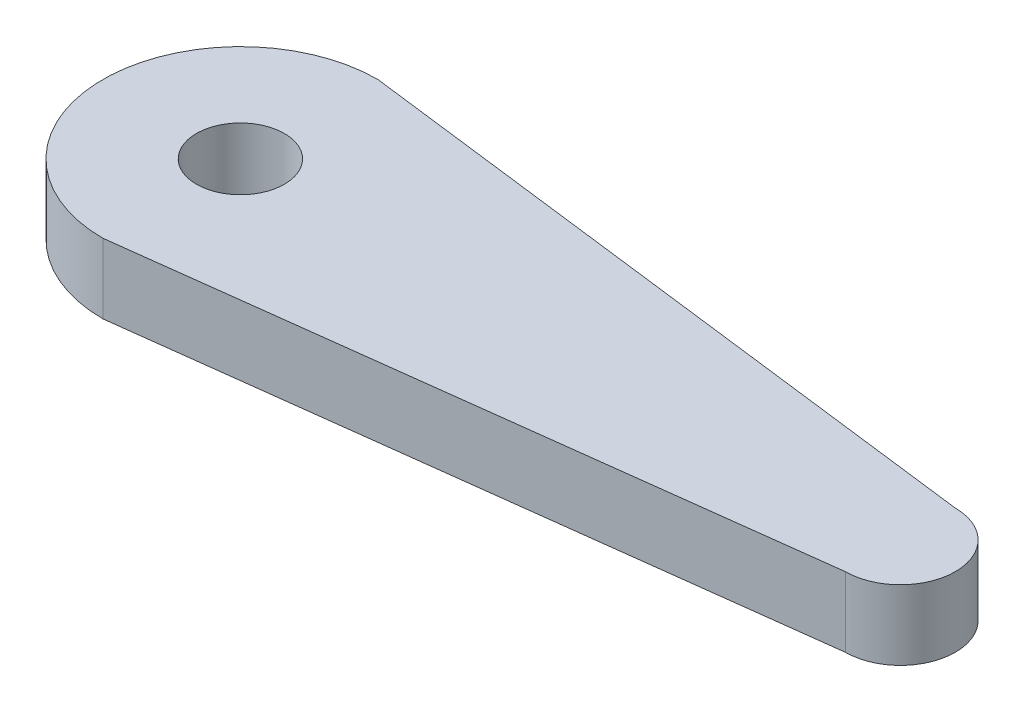
ISO-10303-21;
HEADER;
FILE_DESCRIPTION(('STEP AP214'),'2;1');
FILE_NAME('part.step','',(''),(''),'','','');
FILE_SCHEMA(('AUTOMOTIVE_DESIGN { 1 0 10303 214 1 1 1 1 }'));
ENDSEC;
DATA;
#1=APPLICATION_CONTEXT('core data for automotive mechanical design processes');
#2=APPLICATION_PROTOCOL_DEFINITION('international standard','automotive_design',2000,#1);
#3=PRODUCT_CONTEXT('',#1,'mechanical');
#4=PRODUCT('Part','Part','',(#3));
#5=PRODUCT_RELATED_PRODUCT_CATEGORY('part','',(#4));
#6=PRODUCT_DEFINITION_FORMATION('','',#4);
#7=PRODUCT_DEFINITION_CONTEXT('part definition',#1,'design');
#8=PRODUCT_DEFINITION('design','',#6,#7);
#9=PRODUCT_DEFINITION_SHAPE('','',#8);
#10=(LENGTH_UNIT() NAMED_UNIT(*) SI_UNIT(.MILLI.,.METRE.));
#11=(NAMED_UNIT(*) PLANE_ANGLE_UNIT() SI_UNIT($,.RADIAN.));
#12=(NAMED_UNIT(*) SI_UNIT($,.STERADIAN.) SOLID_ANGLE_UNIT());
#13=UNCERTAINTY_MEASURE_WITH_UNIT(LENGTH_MEASURE(1.E-05),#10,'distance_accuracy_value','');
#14=(GEOMETRIC_REPRESENTATION_CONTEXT(3) GLOBAL_UNCERTAINTY_ASSIGNED_CONTEXT((#13)) GLOBAL_UNIT_ASSIGNED_CONTEXT((#10,
#11,#12)) REPRESENTATION_CONTEXT('',''));
#15=CARTESIAN_POINT('',(0.,0.,0.));
#16=DIRECTION('',(0.,0.,1.));
#17=DIRECTION('',(1.,0.,0.));
#18=AXIS2_PLACEMENT_3D('',#15,#16,#17);
#19=CARTESIAN_POINT('',(1.53846153846154,6.35,12.3076923076923));
#20=DIRECTION('',(0.124034734589208,0.,0.992277876713668));
#21=DIRECTION('',(0.992277876713668,0.,-0.124034734589208));
#22=AXIS2_PLACEMENT_3D('',#19,#20,#21);
#23=PLANE('',#22);
#24=DIRECTION('',(-0.992277876713668,0.,0.124034734589208));
#25=VECTOR('',#24,1.);
#26=CARTESIAN_POINT('',(1.53846153846154,0.,12.3076923076923));
#27=LINE('',#26,#25);
#28=CARTESIAN_POINT('',(60.,0.,5.));
#29=VERTEX_POINT('',#28);
#30=CARTESIAN_POINT('',(0.,0.,12.5));
#31=VERTEX_POINT('',#30);
#32=EDGE_CURVE('E102',#29,#31,#27,.T.);
#33=ORIENTED_EDGE('',*,*,#32,.F.);
#34=DIRECTION('',(0.,-1.,0.));
#35=VECTOR('',#34,1.);
#36=CARTESIAN_POINT('',(60.,6.35,5.));
#37=LINE('',#36,#35);
#38=CARTESIAN_POINT('',(60.,6.35,5.));
#39=VERTEX_POINT('',#38);
#40=EDGE_CURVE('E11',#39,#29,#37,.T.);
#41=ORIENTED_EDGE('',*,*,#40,.F.);
#42=DIRECTION('',(-0.992277876713668,0.,0.124034734589208));
#43=VECTOR('',#42,1.);
#44=CARTESIAN_POINT('',(1.53846153846154,6.35,12.3076923076923));
#45=LINE('',#44,#43);
#46=CARTESIAN_POINT('',(0.,6.35,12.5));
#47=VERTEX_POINT('',#46);
#48=EDGE_CURVE('E84',#39,#47,#45,.T.);
#49=ORIENTED_EDGE('',*,*,#48,.T.);
#50=DIRECTION('',(0.,-1.,0.));
#51=VECTOR('',#50,1.);
#52=CARTESIAN_POINT('',(0.,6.35,12.5));
#53=LINE('',#52,#51);
#54=EDGE_CURVE('E74',#47,#31,#53,.T.);
#55=ORIENTED_EDGE('',*,*,#54,.T.);
#56=EDGE_LOOP('',(#33,#41,#49,#55));
#57=FACE_BOUND('',#56,.T.);
#58=ADVANCED_FACE('F35',(#57),#23,.T.);
#59=CARTESIAN_POINT('',(60.,6.35,0.));
#60=DIRECTION('',(0.,-1.,0.));
#61=DIRECTION('',(0.,0.,-1.));
#62=AXIS2_PLACEMENT_3D('',#59,#60,#61);
#63=CYLINDRICAL_SURFACE('',#62,5.);
#64=CARTESIAN_POINT('',(60.,0.,0.));
#65=DIRECTION('',(0.,1.,0.));
#66=DIRECTION('',(0.,0.,1.));
#67=AXIS2_PLACEMENT_3D('',#64,#65,#66);
#68=CIRCLE('',#67,5.);
#69=CARTESIAN_POINT('',(60.,0.,-5.));
#70=VERTEX_POINT('',#69);
#71=EDGE_CURVE('E90',#29,#70,#68,.T.);
#72=ORIENTED_EDGE('',*,*,#71,.T.);
#73=DIRECTION('',(0.,-1.,0.));
#74=VECTOR('',#73,1.);
#75=CARTESIAN_POINT('',(60.,6.35,-5.));
#76=LINE('',#75,#74);
#77=CARTESIAN_POINT('',(60.,6.35,-5.));
#78=VERTEX_POINT('',#77);
#79=EDGE_CURVE('E44',#78,#70,#76,.T.);
#80=ORIENTED_EDGE('',*,*,#79,.F.);
#81=CARTESIAN_POINT('',(60.,6.35,0.));
#82=DIRECTION('',(0.,1.,0.));
#83=DIRECTION('',(0.,0.,1.));
#84=AXIS2_PLACEMENT_3D('',#81,#82,#83);
#85=CIRCLE('',#84,5.);
#86=EDGE_CURVE('E79',#39,#78,#85,.T.);
#87=ORIENTED_EDGE('',*,*,#86,.F.);
#88=ORIENTED_EDGE('',*,*,#40,.T.);
#89=EDGE_LOOP('',(#72,#80,#87,#88));
#90=FACE_BOUND('',#89,.T.);
#91=ADVANCED_FACE('F88',(#90),#63,.T.);
#92=CARTESIAN_POINT('',(1.53846153846154,6.35,-12.3076923076923));
#93=DIRECTION('',(0.124034734589208,0.,-0.992277876713668));
#94=DIRECTION('',(-0.992277876713668,0.,-0.124034734589208));
#95=AXIS2_PLACEMENT_3D('',#92,#93,#94);
#96=PLANE('',#95);
#97=DIRECTION('',(0.992277876713668,0.,0.124034734589208));
#98=VECTOR('',#97,1.);
#99=CARTESIAN_POINT('',(1.53846153846154,0.,-12.3076923076923));
#100=LINE('',#99,#98);
#101=CARTESIAN_POINT('',(0.,0.,-12.5));
#102=VERTEX_POINT('',#101);
#103=EDGE_CURVE('E106',#102,#70,#100,.T.);
#104=ORIENTED_EDGE('',*,*,#103,.F.);
#105=DIRECTION('',(0.,-1.,0.));
#106=VECTOR('',#105,1.);
#107=CARTESIAN_POINT('',(0.,6.35,-12.5));
#108=LINE('',#107,#106);
#109=CARTESIAN_POINT('',(0.,6.35,-12.5));
#110=VERTEX_POINT('',#109);
#111=EDGE_CURVE('E67',#110,#102,#108,.T.);
#112=ORIENTED_EDGE('',*,*,#111,.F.);
#113=DIRECTION('',(0.992277876713668,0.,0.124034734589208));
#114=VECTOR('',#113,1.);
#115=CARTESIAN_POINT('',(1.53846153846154,6.35,-12.3076923076923));
#116=LINE('',#115,#114);
#117=EDGE_CURVE('E83',#110,#78,#116,.T.);
#118=ORIENTED_EDGE('',*,*,#117,.T.);
#119=ORIENTED_EDGE('',*,*,#79,.T.);
#120=EDGE_LOOP('',(#104,#112,#118,#119));
#121=FACE_BOUND('',#120,.T.);
#122=ADVANCED_FACE('F94',(#121),#96,.T.);
#123=CARTESIAN_POINT('',(0.,6.35,0.));
#124=DIRECTION('',(0.,-1.,0.));
#125=DIRECTION('',(0.,0.,-1.));
#126=AXIS2_PLACEMENT_3D('',#123,#124,#125);
#127=CYLINDRICAL_SURFACE('',#126,4.);
#128=CARTESIAN_POINT('',(0.,6.35,0.));
#129=DIRECTION('',(0.,1.,0.));
#130=DIRECTION('',(0.,0.,1.));
#131=AXIS2_PLACEMENT_3D('',#128,#129,#130);
#132=CIRCLE('',#131,4.);
#133=CARTESIAN_POINT('',(0.,6.35,4.));
#134=VERTEX_POINT('',#133);
#135=EDGE_CURVE('E110',#134,#134,#132,.T.);
#136=ORIENTED_EDGE('',*,*,#135,.T.);
#137=EDGE_LOOP('',(#136));
#138=FACE_BOUND('',#137,.T.);
#139=CARTESIAN_POINT('',(0.,0.,0.));
#140=DIRECTION('',(0.,1.,0.));
#141=DIRECTION('',(0.,0.,1.));
#142=AXIS2_PLACEMENT_3D('',#139,#140,#141);
#143=CIRCLE('',#142,4.);
#144=CARTESIAN_POINT('',(0.,0.,4.));
#145=VERTEX_POINT('',#144);
#146=EDGE_CURVE('E99',#145,#145,#143,.T.);
#147=ORIENTED_EDGE('',*,*,#146,.F.);
#148=EDGE_LOOP('',(#147));
#149=FACE_BOUND('',#148,.T.);
#150=ADVANCED_FACE('F37',(#138,#149),#127,.F.);
#151=CARTESIAN_POINT('',(0.,6.35,0.));
#152=DIRECTION('',(0.,-1.,0.));
#153=DIRECTION('',(0.,0.,-1.));
#154=AXIS2_PLACEMENT_3D('',#151,#152,#153);
#155=CYLINDRICAL_SURFACE('',#154,12.5);
#156=CARTESIAN_POINT('',(0.,0.,0.));
#157=DIRECTION('',(0.,1.,0.));
#158=DIRECTION('',(0.,0.,1.));
#159=AXIS2_PLACEMENT_3D('',#156,#157,#158);
#160=CIRCLE('',#159,12.5);
#161=EDGE_CURVE('E108',#102,#31,#160,.T.);
#162=ORIENTED_EDGE('',*,*,#161,.T.);
#163=ORIENTED_EDGE('',*,*,#54,.F.);
#164=CARTESIAN_POINT('',(0.,6.35,0.));
#165=DIRECTION('',(0.,1.,0.));
#166=DIRECTION('',(0.,0.,1.));
#167=AXIS2_PLACEMENT_3D('',#164,#165,#166);
#168=CIRCLE('',#167,12.5);
#169=EDGE_CURVE('E52',#110,#47,#168,.T.);
#170=ORIENTED_EDGE('',*,*,#169,.F.);
#171=ORIENTED_EDGE('',*,*,#111,.T.);
#172=EDGE_LOOP('',(#162,#163,#170,#171));
#173=FACE_BOUND('',#172,.T.);
#174=ADVANCED_FACE('F124',(#173),#155,.T.);
#175=CARTESIAN_POINT('',(0.,6.35,0.));
#176=DIRECTION('',(0.,1.,0.));
#177=DIRECTION('',(0.,0.,1.));
#178=AXIS2_PLACEMENT_3D('',#175,#176,#177);
#179=PLANE('',#178);
#180=ORIENTED_EDGE('',*,*,#135,.F.);
#181=EDGE_LOOP('',(#180));
#182=FACE_BOUND('',#181,.T.);
#183=ORIENTED_EDGE('',*,*,#48,.F.);
#184=ORIENTED_EDGE('',*,*,#86,.T.);
#185=ORIENTED_EDGE('',*,*,#117,.F.);
#186=ORIENTED_EDGE('',*,*,#169,.T.);
#187=EDGE_LOOP('',(#183,#184,#185,#186));
#188=FACE_BOUND('',#187,.T.);
#189=ADVANCED_FACE('F81',(#182,#188),#179,.T.);
#190=CARTESIAN_POINT('',(0.,0.,0.));
#191=DIRECTION('',(0.,1.,0.));
#192=DIRECTION('',(0.,0.,1.));
#193=AXIS2_PLACEMENT_3D('',#190,#191,#192);
#194=PLANE('',#193);
#195=ORIENTED_EDGE('',*,*,#146,.T.);
#196=EDGE_LOOP('',(#195));
#197=FACE_BOUND('',#196,.T.);
#198=ORIENTED_EDGE('',*,*,#32,.T.);
#199=ORIENTED_EDGE('',*,*,#161,.F.);
#200=ORIENTED_EDGE('',*,*,#103,.T.);
#201=ORIENTED_EDGE('',*,*,#71,.F.);
#202=EDGE_LOOP('',(#198,#199,#200,#201));
#203=FACE_BOUND('',#202,.T.);
#204=ADVANCED_FACE('F127',(#197,#203),#194,.F.);
#205=CLOSED_SHELL('',(#58,#91,#122,#150,#174,#189,#204));
#206=MANIFOLD_SOLID_BREP('B2',#205);
#207=ADVANCED_BREP_SHAPE_REPRESENTATION('',(#18,#206),#14);
#208=SHAPE_DEFINITION_REPRESENTATION(#9,#207);
ENDSEC;
END-ISO-10303-21;
